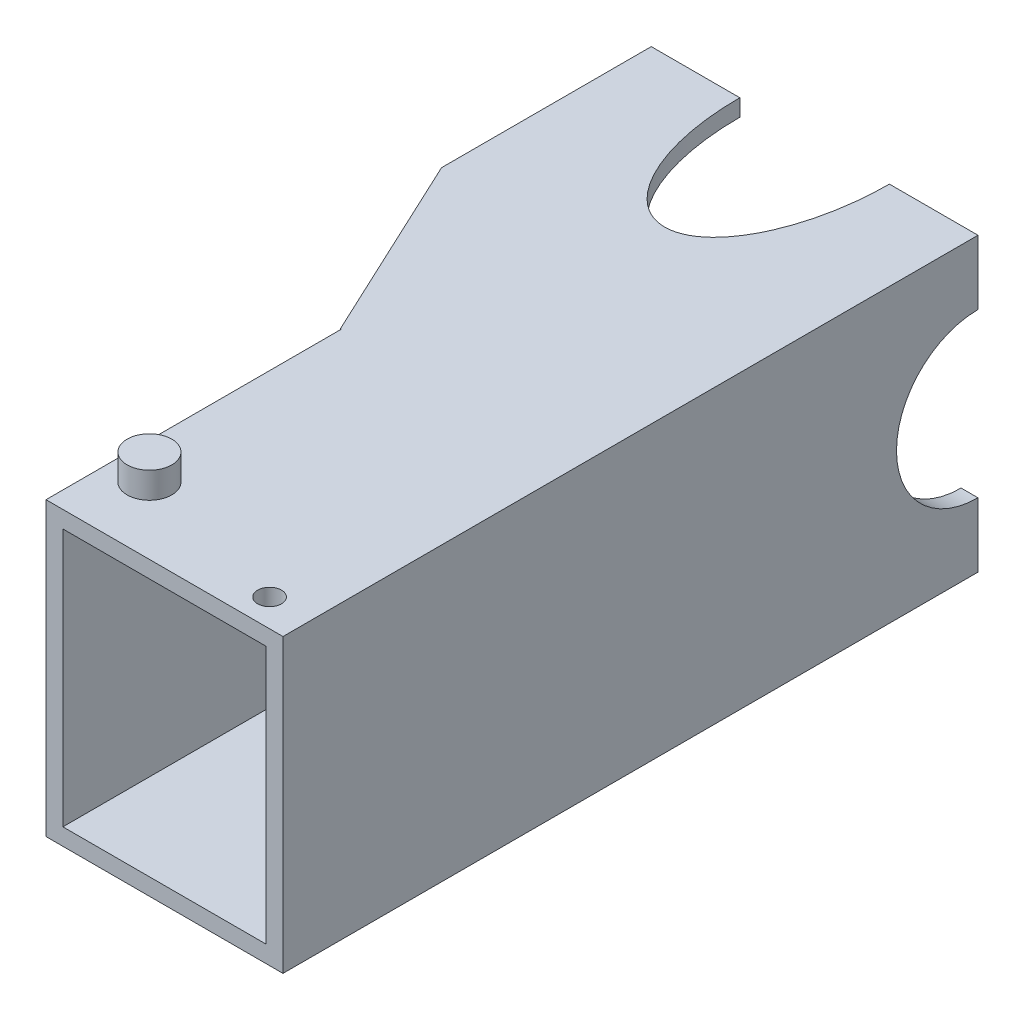
ISO-10303-21;
HEADER;
FILE_DESCRIPTION(('STEP AP214'),'2;1');
FILE_NAME('part.step','',(''),(''),'','','');
FILE_SCHEMA(('AUTOMOTIVE_DESIGN { 1 0 10303 214 1 1 1 1 }'));
ENDSEC;
DATA;
#1=APPLICATION_CONTEXT('core data for automotive mechanical design processes');
#2=APPLICATION_PROTOCOL_DEFINITION('international standard','automotive_design',2000,#1);
#3=PRODUCT_CONTEXT('',#1,'mechanical');
#4=PRODUCT('Part','Part','',(#3));
#5=PRODUCT_RELATED_PRODUCT_CATEGORY('part','',(#4));
#6=PRODUCT_DEFINITION_FORMATION('','',#4);
#7=PRODUCT_DEFINITION_CONTEXT('part definition',#1,'design');
#8=PRODUCT_DEFINITION('design','',#6,#7);
#9=PRODUCT_DEFINITION_SHAPE('','',#8);
#10=(LENGTH_UNIT() NAMED_UNIT(*) SI_UNIT(.MILLI.,.METRE.));
#11=(NAMED_UNIT(*) PLANE_ANGLE_UNIT() SI_UNIT($,.RADIAN.));
#12=(NAMED_UNIT(*) SI_UNIT($,.STERADIAN.) SOLID_ANGLE_UNIT());
#13=UNCERTAINTY_MEASURE_WITH_UNIT(LENGTH_MEASURE(1.E-05),#10,'distance_accuracy_value','');
#14=(GEOMETRIC_REPRESENTATION_CONTEXT(3) GLOBAL_UNCERTAINTY_ASSIGNED_CONTEXT((#13)) GLOBAL_UNIT_ASSIGNED_CONTEXT((#10,
#11,#12)) REPRESENTATION_CONTEXT('',''));
#15=CARTESIAN_POINT('',(0.,0.,0.));
#16=DIRECTION('',(0.,0.,1.));
#17=DIRECTION('',(1.,0.,0.));
#18=AXIS2_PLACEMENT_3D('',#15,#16,#17);
#19=CARTESIAN_POINT('',(0.,0.,0.));
#20=DIRECTION('',(0.,0.,-1.));
#21=DIRECTION('',(-1.,0.,0.));
#22=AXIS2_PLACEMENT_3D('',#19,#20,#21);
#23=PLANE('',#22);
#24=DIRECTION('',(1.,0.,0.));
#25=VECTOR('',#24,1.);
#26=CARTESIAN_POINT('',(-100.,-8.65000000000002,0.));
#27=LINE('',#26,#25);
#28=CARTESIAN_POINT('',(-43.9,-8.65000000000001,0.));
#29=VERTEX_POINT('',#28);
#30=CARTESIAN_POINT('',(-41.63,-8.65000000000001,0.));
#31=VERTEX_POINT('',#30);
#32=EDGE_CURVE('E49',#29,#31,#27,.T.);
#33=ORIENTED_EDGE('',*,*,#32,.F.);
#34=DIRECTION('',(0.,-1.,0.));
#35=VECTOR('',#34,1.);
#36=CARTESIAN_POINT('',(-43.9,0.,0.));
#37=LINE('',#36,#35);
#38=CARTESIAN_POINT('',(-43.9,0.,0.));
#39=VERTEX_POINT('',#38);
#40=EDGE_CURVE('E223',#39,#29,#37,.T.);
#41=ORIENTED_EDGE('',*,*,#40,.F.);
#42=DIRECTION('',(-1.,0.,0.));
#43=VECTOR('',#42,1.);
#44=CARTESIAN_POINT('',(0.,0.,0.));
#45=LINE('',#44,#43);
#46=CARTESIAN_POINT('',(-32.0000394122705,0.,0.));
#47=VERTEX_POINT('',#46);
#48=EDGE_CURVE('E213',#47,#39,#45,.T.);
#49=ORIENTED_EDGE('',*,*,#48,.F.);
#50=DIRECTION('',(0.,1.,0.));
#51=VECTOR('',#50,1.);
#52=CARTESIAN_POINT('',(-32.0000394122705,-100.,0.));
#53=LINE('',#52,#51);
#54=CARTESIAN_POINT('',(-32.0000394122705,-2.27,0.));
#55=VERTEX_POINT('',#54);
#56=EDGE_CURVE('E686',#55,#47,#53,.T.);
#57=ORIENTED_EDGE('',*,*,#56,.F.);
#58=DIRECTION('',(1.,0.,0.));
#59=VECTOR('',#58,1.);
#60=CARTESIAN_POINT('',(-41.63,-2.27,0.));
#61=LINE('',#60,#59);
#62=CARTESIAN_POINT('',(-41.63,-2.27,0.));
#63=VERTEX_POINT('',#62);
#64=EDGE_CURVE('E276',#63,#55,#61,.T.);
#65=ORIENTED_EDGE('',*,*,#64,.F.);
#66=DIRECTION('',(0.,1.,0.));
#67=VECTOR('',#66,1.);
#68=CARTESIAN_POINT('',(-41.63,-36.93,0.));
#69=LINE('',#68,#67);
#70=EDGE_CURVE('E285',#31,#63,#69,.T.);
#71=ORIENTED_EDGE('',*,*,#70,.F.);
#72=EDGE_LOOP('',(#33,#41,#49,#57,#65,#71));
#73=FACE_BOUND('',#72,.T.);
#74=ADVANCED_FACE('F34',(#73),#23,.T.);
#75=DIRECTION('',(1.,0.,0.));
#76=VECTOR('',#75,1.);
#77=CARTESIAN_POINT('',(-100.,-8.65000000000002,0.));
#78=LINE('',#77,#76);
#79=CARTESIAN_POINT('',(-2.26999999999999,-8.65000000000001,0.));
#80=VERTEX_POINT('',#79);
#81=CARTESIAN_POINT('',(0.,-8.65,0.));
#82=VERTEX_POINT('',#81);
#83=EDGE_CURVE('E186',#80,#82,#78,.T.);
#84=ORIENTED_EDGE('',*,*,#83,.F.);
#85=DIRECTION('',(0.,-1.,0.));
#86=VECTOR('',#85,1.);
#87=CARTESIAN_POINT('',(-2.27,-36.93,0.));
#88=LINE('',#87,#86);
#89=CARTESIAN_POINT('',(-2.26999999999999,-2.27,0.));
#90=VERTEX_POINT('',#89);
#91=EDGE_CURVE('E280',#90,#80,#88,.T.);
#92=ORIENTED_EDGE('',*,*,#91,.F.);
#93=CARTESIAN_POINT('',(-11.8999605877295,-2.27,0.));
#94=VERTEX_POINT('',#93);
#95=EDGE_CURVE('E272',#94,#90,#61,.T.);
#96=ORIENTED_EDGE('',*,*,#95,.F.);
#97=DIRECTION('',(0.,1.,0.));
#98=VECTOR('',#97,1.);
#99=CARTESIAN_POINT('',(-11.8999605877295,-100.,0.));
#100=LINE('',#99,#98);
#101=CARTESIAN_POINT('',(-11.8999605877295,0.,0.));
#102=VERTEX_POINT('',#101);
#103=EDGE_CURVE('E279',#102,#94,#100,.F.);
#104=ORIENTED_EDGE('',*,*,#103,.F.);
#105=CARTESIAN_POINT('',(0.,0.,0.));
#106=VERTEX_POINT('',#105);
#107=EDGE_CURVE('E209',#106,#102,#45,.T.);
#108=ORIENTED_EDGE('',*,*,#107,.F.);
#109=DIRECTION('',(0.,1.,0.));
#110=VECTOR('',#109,1.);
#111=CARTESIAN_POINT('',(0.,0.,0.));
#112=LINE('',#111,#110);
#113=EDGE_CURVE('E200',#82,#106,#112,.T.);
#114=ORIENTED_EDGE('',*,*,#113,.F.);
#115=EDGE_LOOP('',(#84,#92,#96,#104,#108,#114));
#116=FACE_BOUND('',#115,.T.);
#117=ADVANCED_FACE('F206',(#116),#23,.T.);
#118=DIRECTION('',(1.,0.,0.));
#119=VECTOR('',#118,1.);
#120=CARTESIAN_POINT('',(-100.,-30.55,0.));
#121=LINE('',#120,#119);
#122=CARTESIAN_POINT('',(-41.63,-30.55,0.));
#123=VERTEX_POINT('',#122);
#124=CARTESIAN_POINT('',(-43.9,-30.55,0.));
#125=VERTEX_POINT('',#124);
#126=EDGE_CURVE('E354',#123,#125,#121,.F.);
#127=ORIENTED_EDGE('',*,*,#126,.F.);
#128=CARTESIAN_POINT('',(-41.63,-36.93,0.));
#129=VERTEX_POINT('',#128);
#130=EDGE_CURVE('E281',#129,#123,#69,.T.);
#131=ORIENTED_EDGE('',*,*,#130,.F.);
#132=DIRECTION('',(-1.,0.,0.));
#133=VECTOR('',#132,1.);
#134=CARTESIAN_POINT('',(-41.63,-36.93,0.));
#135=LINE('',#134,#133);
#136=CARTESIAN_POINT('',(-32.0000394122705,-36.93,0.));
#137=VERTEX_POINT('',#136);
#138=EDGE_CURVE('E290',#137,#129,#135,.T.);
#139=ORIENTED_EDGE('',*,*,#138,.F.);
#140=CARTESIAN_POINT('',(-32.0000394122705,-39.2,0.));
#141=VERTEX_POINT('',#140);
#142=EDGE_CURVE('E681',#141,#137,#53,.T.);
#143=ORIENTED_EDGE('',*,*,#142,.F.);
#144=DIRECTION('',(1.,0.,0.));
#145=VECTOR('',#144,1.);
#146=CARTESIAN_POINT('',(0.,-39.2,0.));
#147=LINE('',#146,#145);
#148=CARTESIAN_POINT('',(-43.9,-39.2,0.));
#149=VERTEX_POINT('',#148);
#150=EDGE_CURVE('E227',#149,#141,#147,.T.);
#151=ORIENTED_EDGE('',*,*,#150,.F.);
#152=EDGE_CURVE('E222',#125,#149,#37,.T.);
#153=ORIENTED_EDGE('',*,*,#152,.F.);
#154=EDGE_LOOP('',(#127,#131,#139,#143,#151,#153));
#155=FACE_BOUND('',#154,.T.);
#156=ADVANCED_FACE('F430',(#155),#23,.T.);
#157=CARTESIAN_POINT('',(0.,0.,93.38));
#158=DIRECTION('',(-1.,0.,0.));
#159=DIRECTION('',(0.,-1.,0.));
#160=AXIS2_PLACEMENT_3D('',#157,#158,#159);
#161=PLANE('',#160);
#162=CARTESIAN_POINT('',(0.,-39.2,0.));
#163=VERTEX_POINT('',#162);
#164=CARTESIAN_POINT('',(0.,-30.55,0.));
#165=VERTEX_POINT('',#164);
#166=EDGE_CURVE('E204',#163,#165,#112,.T.);
#167=ORIENTED_EDGE('',*,*,#166,.T.);
#168=CARTESIAN_POINT('',(0.,-19.6,0.));
#169=DIRECTION('',(1.,0.,0.));
#170=DIRECTION('',(0.,1.,0.));
#171=AXIS2_PLACEMENT_3D('',#168,#169,#170);
#172=CIRCLE('',#171,10.95);
#173=EDGE_CURVE('E189',#82,#165,#172,.T.);
#174=ORIENTED_EDGE('',*,*,#173,.F.);
#175=ORIENTED_EDGE('',*,*,#113,.T.);
#176=DIRECTION('',(0.,0.,-1.));
#177=VECTOR('',#176,1.);
#178=CARTESIAN_POINT('',(0.,0.,93.38));
#179=LINE('',#178,#177);
#180=CARTESIAN_POINT('',(0.,0.,93.38));
#181=VERTEX_POINT('',#180);
#182=EDGE_CURVE('E239',#181,#106,#179,.T.);
#183=ORIENTED_EDGE('',*,*,#182,.F.);
#184=DIRECTION('',(0.,1.,0.));
#185=VECTOR('',#184,1.);
#186=CARTESIAN_POINT('',(0.,0.,93.38));
#187=LINE('',#186,#185);
#188=CARTESIAN_POINT('',(0.,-39.2,93.38));
#189=VERTEX_POINT('',#188);
#190=EDGE_CURVE('E230',#189,#181,#187,.T.);
#191=ORIENTED_EDGE('',*,*,#190,.F.);
#192=DIRECTION('',(0.,0.,-1.));
#193=VECTOR('',#192,1.);
#194=CARTESIAN_POINT('',(0.,-39.2,93.38));
#195=LINE('',#194,#193);
#196=EDGE_CURVE('E231',#189,#163,#195,.T.);
#197=ORIENTED_EDGE('',*,*,#196,.T.);
#198=EDGE_LOOP('',(#167,#174,#175,#183,#191,#197));
#199=FACE_BOUND('',#198,.T.);
#200=ADVANCED_FACE('F198',(#199),#161,.F.);
#201=CARTESIAN_POINT('',(0.,0.,93.38));
#202=DIRECTION('',(0.,-1.,0.));
#203=DIRECTION('',(1.,0.,0.));
#204=AXIS2_PLACEMENT_3D('',#201,#202,#203);
#205=PLANE('',#204);
#206=CARTESIAN_POINT('',(-5.5,0.,89.68));
#207=DIRECTION('',(0.,1.,0.));
#208=DIRECTION('',(-1.,0.,0.));
#209=AXIS2_PLACEMENT_3D('',#206,#207,#208);
#210=CIRCLE('',#209,1.6);
#211=CARTESIAN_POINT('',(-7.1,0.,89.68));
#212=VERTEX_POINT('',#211);
#213=EDGE_CURVE('E266',#212,#212,#210,.T.);
#214=ORIENTED_EDGE('',*,*,#213,.F.);
#215=EDGE_LOOP('',(#214));
#216=FACE_BOUND('',#215,.T.);
#217=CARTESIAN_POINT('',(-26.94,0.,84.38));
#218=DIRECTION('',(0.,-1.,0.));
#219=DIRECTION('',(1.,0.,0.));
#220=AXIS2_PLACEMENT_3D('',#217,#218,#219);
#221=CIRCLE('',#220,3.);
#222=CARTESIAN_POINT('',(-23.94,0.,84.38));
#223=VERTEX_POINT('',#222);
#224=EDGE_CURVE('E260',#223,#223,#221,.F.);
#225=ORIENTED_EDGE('',*,*,#224,.F.);
#226=EDGE_LOOP('',(#225));
#227=FACE_BOUND('',#226,.T.);
#228=ORIENTED_EDGE('',*,*,#107,.T.);
#229=CARTESIAN_POINT('',(-21.95,0.,0.));
#230=DIRECTION('',(0.,1.,0.));
#231=DIRECTION('',(0.00323381393674884,0.,-0.999994771210041));
#232=AXIS2_PLACEMENT_3D('',#229,#230,#231);
#233=ELLIPSE('',#232,20.1001050992277,10.05);
#234=EDGE_CURVE('E356',#47,#102,#233,.T.);
#235=ORIENTED_EDGE('',*,*,#234,.F.);
#236=ORIENTED_EDGE('',*,*,#48,.T.);
#237=DIRECTION('',(0.,0.,-1.));
#238=VECTOR('',#237,1.);
#239=CARTESIAN_POINT('',(-43.9,0.,93.38));
#240=LINE('',#239,#238);
#241=CARTESIAN_POINT('',(-43.9,0.,28.1778938640133));
#242=VERTEX_POINT('',#241);
#243=EDGE_CURVE('E236',#242,#39,#240,.T.);
#244=ORIENTED_EDGE('',*,*,#243,.F.);
#245=DIRECTION('',(-0.423731605419439,0.,-0.905787793342715));
#246=VECTOR('',#245,1.);
#247=CARTESIAN_POINT('',(-44.03,0.,27.9));
#248=LINE('',#247,#246);
#249=CARTESIAN_POINT('',(-31.97,0.,53.68));
#250=VERTEX_POINT('',#249);
#251=EDGE_CURVE('E298',#250,#242,#248,.T.);
#252=ORIENTED_EDGE('',*,*,#251,.F.);
#253=DIRECTION('',(-1.,0.,0.));
#254=VECTOR('',#253,1.);
#255=CARTESIAN_POINT('',(-43.9,0.,53.68));
#256=LINE('',#255,#254);
#257=CARTESIAN_POINT('',(-31.84,0.,53.68));
#258=VERTEX_POINT('',#257);
#259=EDGE_CURVE('E315',#258,#250,#256,.T.);
#260=ORIENTED_EDGE('',*,*,#259,.F.);
#261=DIRECTION('',(0.,0.,-1.));
#262=VECTOR('',#261,1.);
#263=CARTESIAN_POINT('',(-31.84,0.,93.38));
#264=LINE('',#263,#262);
#265=CARTESIAN_POINT('',(-31.84,0.,93.38));
#266=VERTEX_POINT('',#265);
#267=EDGE_CURVE('E312',#266,#258,#264,.T.);
#268=ORIENTED_EDGE('',*,*,#267,.F.);
#269=DIRECTION('',(-1.,0.,0.));
#270=VECTOR('',#269,1.);
#271=CARTESIAN_POINT('',(0.,0.,93.38));
#272=LINE('',#271,#270);
#273=EDGE_CURVE('E320',#181,#266,#272,.T.);
#274=ORIENTED_EDGE('',*,*,#273,.F.);
#275=ORIENTED_EDGE('',*,*,#182,.T.);
#276=EDGE_LOOP('',(#228,#235,#236,#244,#252,#260,#268,#274,#275));
#277=FACE_BOUND('',#276,.T.);
#278=ADVANCED_FACE('F332',(#216,#227,#277),#205,.F.);
#279=CARTESIAN_POINT('',(-43.9,0.,93.38));
#280=DIRECTION('',(1.,0.,0.));
#281=DIRECTION('',(0.,1.,0.));
#282=AXIS2_PLACEMENT_3D('',#279,#280,#281);
#283=PLANE('',#282);
#284=ORIENTED_EDGE('',*,*,#40,.T.);
#285=CARTESIAN_POINT('',(-43.9,-19.6,0.));
#286=DIRECTION('',(1.,0.,0.));
#287=DIRECTION('',(0.,1.,0.));
#288=AXIS2_PLACEMENT_3D('',#285,#286,#287);
#289=CIRCLE('',#288,10.95);
#290=EDGE_CURVE('E353',#29,#125,#289,.T.);
#291=ORIENTED_EDGE('',*,*,#290,.T.);
#292=ORIENTED_EDGE('',*,*,#152,.T.);
#293=DIRECTION('',(0.,0.,-1.));
#294=VECTOR('',#293,1.);
#295=CARTESIAN_POINT('',(-43.9,-39.2,93.38));
#296=LINE('',#295,#294);
#297=CARTESIAN_POINT('',(-43.9,-39.2,28.1778938640132));
#298=VERTEX_POINT('',#297);
#299=EDGE_CURVE('E233',#298,#149,#296,.T.);
#300=ORIENTED_EDGE('',*,*,#299,.F.);
#301=DIRECTION('',(0.,1.,0.));
#302=VECTOR('',#301,1.);
#303=CARTESIAN_POINT('',(-43.9,0.,28.1778938640132));
#304=LINE('',#303,#302);
#305=EDGE_CURVE('E309',#298,#242,#304,.T.);
#306=ORIENTED_EDGE('',*,*,#305,.T.);
#307=ORIENTED_EDGE('',*,*,#243,.T.);
#308=EDGE_LOOP('',(#284,#291,#292,#300,#306,#307));
#309=FACE_BOUND('',#308,.T.);
#310=ADVANCED_FACE('F349',(#309),#283,.F.);
#311=CARTESIAN_POINT('',(0.,-39.2,93.38));
#312=DIRECTION('',(0.,1.,0.));
#313=DIRECTION('',(-1.,0.,0.));
#314=AXIS2_PLACEMENT_3D('',#311,#312,#313);
#315=PLANE('',#314);
#316=CARTESIAN_POINT('',(-26.94,-39.2,84.38));
#317=DIRECTION('',(0.,1.,0.));
#318=DIRECTION('',(-1.,0.,0.));
#319=AXIS2_PLACEMENT_3D('',#316,#317,#318);
#320=CIRCLE('',#319,3.);
#321=CARTESIAN_POINT('',(-29.94,-39.2,84.38));
#322=VERTEX_POINT('',#321);
#323=EDGE_CURVE('E257',#322,#322,#320,.F.);
#324=ORIENTED_EDGE('',*,*,#323,.F.);
#325=EDGE_LOOP('',(#324));
#326=FACE_BOUND('',#325,.T.);
#327=ORIENTED_EDGE('',*,*,#150,.T.);
#328=CARTESIAN_POINT('',(-21.95,-39.2,0.));
#329=DIRECTION('',(0.,1.,0.));
#330=DIRECTION('',(0.00323381393674884,0.,-0.999994771210041));
#331=AXIS2_PLACEMENT_3D('',#328,#329,#330);
#332=ELLIPSE('',#331,20.1001050992277,10.05);
#333=CARTESIAN_POINT('',(-11.8999605877295,-39.2,0.));
#334=VERTEX_POINT('',#333);
#335=EDGE_CURVE('E679',#141,#334,#332,.T.);
#336=ORIENTED_EDGE('',*,*,#335,.T.);
#337=EDGE_CURVE('E226',#334,#163,#147,.T.);
#338=ORIENTED_EDGE('',*,*,#337,.T.);
#339=ORIENTED_EDGE('',*,*,#196,.F.);
#340=DIRECTION('',(1.,0.,0.));
#341=VECTOR('',#340,1.);
#342=CARTESIAN_POINT('',(0.,-39.2,93.38));
#343=LINE('',#342,#341);
#344=CARTESIAN_POINT('',(-31.84,-39.2,93.38));
#345=VERTEX_POINT('',#344);
#346=EDGE_CURVE('E219',#345,#189,#343,.T.);
#347=ORIENTED_EDGE('',*,*,#346,.F.);
#348=DIRECTION('',(0.,0.,-1.));
#349=VECTOR('',#348,1.);
#350=CARTESIAN_POINT('',(-31.84,-39.2,93.38));
#351=LINE('',#350,#349);
#352=CARTESIAN_POINT('',(-31.84,-39.2,53.68));
#353=VERTEX_POINT('',#352);
#354=EDGE_CURVE('E211',#345,#353,#351,.T.);
#355=ORIENTED_EDGE('',*,*,#354,.T.);
#356=DIRECTION('',(-1.,0.,0.));
#357=VECTOR('',#356,1.);
#358=CARTESIAN_POINT('',(0.,-39.2,53.68));
#359=LINE('',#358,#357);
#360=CARTESIAN_POINT('',(-31.97,-39.2,53.68));
#361=VERTEX_POINT('',#360);
#362=EDGE_CURVE('E244',#353,#361,#359,.T.);
#363=ORIENTED_EDGE('',*,*,#362,.T.);
#364=DIRECTION('',(-0.423731605419439,0.,-0.905787793342715));
#365=VECTOR('',#364,1.);
#366=CARTESIAN_POINT('',(-10.9925419454553,-39.2,98.5223605842588));
#367=LINE('',#366,#365);
#368=EDGE_CURVE('E306',#361,#298,#367,.T.);
#369=ORIENTED_EDGE('',*,*,#368,.T.);
#370=ORIENTED_EDGE('',*,*,#299,.T.);
#371=EDGE_LOOP('',(#327,#336,#338,#339,#347,#355,#363,#369,#370));
#372=FACE_BOUND('',#371,.T.);
#373=ADVANCED_FACE('F328',(#326,#372),#315,.F.);
#374=CARTESIAN_POINT('',(0.,0.,93.38));
#375=DIRECTION('',(0.,0.,-1.));
#376=DIRECTION('',(-1.,0.,0.));
#377=AXIS2_PLACEMENT_3D('',#374,#375,#376);
#378=PLANE('',#377);
#379=DIRECTION('',(1.,0.,0.));
#380=VECTOR('',#379,1.);
#381=CARTESIAN_POINT('',(-29.57,-36.93,93.38));
#382=LINE('',#381,#380);
#383=CARTESIAN_POINT('',(-29.57,-36.93,93.38));
#384=VERTEX_POINT('',#383);
#385=CARTESIAN_POINT('',(-2.27,-36.93,93.38));
#386=VERTEX_POINT('',#385);
#387=EDGE_CURVE('E654',#384,#386,#382,.T.);
#388=ORIENTED_EDGE('',*,*,#387,.F.);
#389=DIRECTION('',(0.,-1.,0.));
#390=VECTOR('',#389,1.);
#391=CARTESIAN_POINT('',(-29.57,-36.93,93.38));
#392=LINE('',#391,#390);
#393=CARTESIAN_POINT('',(-29.57,-2.27,93.38));
#394=VERTEX_POINT('',#393);
#395=EDGE_CURVE('E643',#394,#384,#392,.T.);
#396=ORIENTED_EDGE('',*,*,#395,.F.);
#397=DIRECTION('',(-1.,0.,0.));
#398=VECTOR('',#397,1.);
#399=CARTESIAN_POINT('',(-29.57,-2.27,93.38));
#400=LINE('',#399,#398);
#401=CARTESIAN_POINT('',(-2.26999999999999,-2.27,93.38));
#402=VERTEX_POINT('',#401);
#403=EDGE_CURVE('E646',#402,#394,#400,.T.);
#404=ORIENTED_EDGE('',*,*,#403,.F.);
#405=DIRECTION('',(0.,1.,0.));
#406=VECTOR('',#405,1.);
#407=CARTESIAN_POINT('',(-2.27,-36.93,93.38));
#408=LINE('',#407,#406);
#409=EDGE_CURVE('E649',#386,#402,#408,.T.);
#410=ORIENTED_EDGE('',*,*,#409,.F.);
#411=EDGE_LOOP('',(#388,#396,#404,#410));
#412=FACE_BOUND('',#411,.T.);
#413=ORIENTED_EDGE('',*,*,#273,.T.);
#414=DIRECTION('',(0.,-1.,0.));
#415=VECTOR('',#414,1.);
#416=CARTESIAN_POINT('',(-31.84,0.,93.38));
#417=LINE('',#416,#415);
#418=EDGE_CURVE('E241',#266,#345,#417,.T.);
#419=ORIENTED_EDGE('',*,*,#418,.T.);
#420=ORIENTED_EDGE('',*,*,#346,.T.);
#421=ORIENTED_EDGE('',*,*,#190,.T.);
#422=EDGE_LOOP('',(#413,#419,#420,#421));
#423=FACE_BOUND('',#422,.T.);
#424=ADVANCED_FACE('F325',(#412,#423),#378,.F.);
#425=DIRECTION('',(1.,0.,0.));
#426=VECTOR('',#425,1.);
#427=CARTESIAN_POINT('',(-100.,-30.55,0.));
#428=LINE('',#427,#426);
#429=CARTESIAN_POINT('',(-2.26999999999999,-30.55,0.));
#430=VERTEX_POINT('',#429);
#431=EDGE_CURVE('E57',#165,#430,#428,.F.);
#432=ORIENTED_EDGE('',*,*,#431,.F.);
#433=ORIENTED_EDGE('',*,*,#166,.F.);
#434=ORIENTED_EDGE('',*,*,#337,.F.);
#435=CARTESIAN_POINT('',(-11.8999605877295,-36.93,0.));
#436=VERTEX_POINT('',#435);
#437=EDGE_CURVE('E685',#436,#334,#100,.F.);
#438=ORIENTED_EDGE('',*,*,#437,.F.);
#439=CARTESIAN_POINT('',(-2.27,-36.93,0.));
#440=VERTEX_POINT('',#439);
#441=EDGE_CURVE('E291',#440,#436,#135,.T.);
#442=ORIENTED_EDGE('',*,*,#441,.F.);
#443=EDGE_CURVE('E283',#430,#440,#88,.T.);
#444=ORIENTED_EDGE('',*,*,#443,.F.);
#445=EDGE_LOOP('',(#432,#433,#434,#438,#442,#444));
#446=FACE_BOUND('',#445,.T.);
#447=ADVANCED_FACE('F421',(#446),#23,.T.);
#448=CARTESIAN_POINT('',(-43.9,-93.38,53.68));
#449=DIRECTION('',(0.,0.,-1.));
#450=DIRECTION('',(-1.,0.,0.));
#451=AXIS2_PLACEMENT_3D('',#448,#449,#450);
#452=PLANE('',#451);
#453=ORIENTED_EDGE('',*,*,#259,.T.);
#454=DIRECTION('',(0.,-1.,0.));
#455=VECTOR('',#454,1.);
#456=CARTESIAN_POINT('',(-31.97,-93.38,53.68));
#457=LINE('',#456,#455);
#458=EDGE_CURVE('E247',#250,#361,#457,.T.);
#459=ORIENTED_EDGE('',*,*,#458,.T.);
#460=ORIENTED_EDGE('',*,*,#362,.F.);
#461=DIRECTION('',(0.,1.,0.));
#462=VECTOR('',#461,1.);
#463=CARTESIAN_POINT('',(-31.84,-93.38,53.68));
#464=LINE('',#463,#462);
#465=EDGE_CURVE('E215',#353,#258,#464,.T.);
#466=ORIENTED_EDGE('',*,*,#465,.T.);
#467=EDGE_LOOP('',(#453,#459,#460,#466));
#468=FACE_BOUND('',#467,.T.);
#469=ADVANCED_FACE('F342',(#468),#452,.F.);
#470=CARTESIAN_POINT('',(-31.84,-93.38,93.38));
#471=DIRECTION('',(1.,0.,0.));
#472=DIRECTION('',(0.,1.,0.));
#473=AXIS2_PLACEMENT_3D('',#470,#471,#472);
#474=PLANE('',#473);
#475=ORIENTED_EDGE('',*,*,#418,.F.);
#476=ORIENTED_EDGE('',*,*,#267,.T.);
#477=ORIENTED_EDGE('',*,*,#465,.F.);
#478=ORIENTED_EDGE('',*,*,#354,.F.);
#479=EDGE_LOOP('',(#475,#476,#477,#478));
#480=FACE_BOUND('',#479,.T.);
#481=ADVANCED_FACE('F339',(#480),#474,.F.);
#482=CARTESIAN_POINT('',(-44.03,-93.38,27.9));
#483=DIRECTION('',(0.905787793342715,0.,-0.423731605419439));
#484=DIRECTION('',(-0.423731605419439,0.,-0.905787793342715));
#485=AXIS2_PLACEMENT_3D('',#482,#483,#484);
#486=PLANE('',#485);
#487=ORIENTED_EDGE('',*,*,#368,.F.);
#488=ORIENTED_EDGE('',*,*,#458,.F.);
#489=ORIENTED_EDGE('',*,*,#251,.T.);
#490=ORIENTED_EDGE('',*,*,#305,.F.);
#491=EDGE_LOOP('',(#487,#488,#489,#490));
#492=FACE_BOUND('',#491,.T.);
#493=ADVANCED_FACE('F344',(#492),#486,.F.);
#494=CARTESIAN_POINT('',(-41.63,-36.93,27.4));
#495=DIRECTION('',(-1.,0.,0.));
#496=DIRECTION('',(0.,0.,1.));
#497=AXIS2_PLACEMENT_3D('',#494,#495,#496);
#498=PLANE('',#497);
#499=ORIENTED_EDGE('',*,*,#130,.T.);
#500=CARTESIAN_POINT('',(-41.63,-19.6,0.));
#501=DIRECTION('',(-1.,0.,0.));
#502=DIRECTION('',(0.,0.,1.));
#503=AXIS2_PLACEMENT_3D('',#500,#501,#502);
#504=CIRCLE('',#503,10.95);
#505=EDGE_CURVE('E194',#123,#31,#504,.T.);
#506=ORIENTED_EDGE('',*,*,#505,.T.);
#507=ORIENTED_EDGE('',*,*,#70,.T.);
#508=DIRECTION('',(0.,0.,-1.));
#509=VECTOR('',#508,1.);
#510=CARTESIAN_POINT('',(-41.63,-2.27,27.4));
#511=LINE('',#510,#509);
#512=CARTESIAN_POINT('',(-41.63,-2.27,27.1159776498938));
#513=VERTEX_POINT('',#512);
#514=EDGE_CURVE('E294',#513,#63,#511,.T.);
#515=ORIENTED_EDGE('',*,*,#514,.F.);
#516=DIRECTION('',(0.,-1.,0.));
#517=VECTOR('',#516,1.);
#518=CARTESIAN_POINT('',(-41.63,-36.93,27.1159776498938));
#519=LINE('',#518,#517);
#520=CARTESIAN_POINT('',(-41.63,-36.93,27.1159776498938));
#521=VERTEX_POINT('',#520);
#522=EDGE_CURVE('E657',#513,#521,#519,.T.);
#523=ORIENTED_EDGE('',*,*,#522,.T.);
#524=DIRECTION('',(0.,0.,-1.));
#525=VECTOR('',#524,1.);
#526=CARTESIAN_POINT('',(-41.63,-36.93,27.4));
#527=LINE('',#526,#525);
#528=EDGE_CURVE('E295',#521,#129,#527,.T.);
#529=ORIENTED_EDGE('',*,*,#528,.T.);
#530=EDGE_LOOP('',(#499,#506,#507,#515,#523,#529));
#531=FACE_BOUND('',#530,.T.);
#532=ADVANCED_FACE('F406',(#531),#498,.F.);
#533=CARTESIAN_POINT('',(-41.63,-36.93,27.4));
#534=DIRECTION('',(0.,-1.,0.));
#535=DIRECTION('',(1.,0.,0.));
#536=AXIS2_PLACEMENT_3D('',#533,#534,#535);
#537=PLANE('',#536);
#538=ORIENTED_EDGE('',*,*,#441,.T.);
#539=CARTESIAN_POINT('',(-21.95,-36.93,0.));
#540=DIRECTION('',(0.,1.,0.));
#541=DIRECTION('',(0.00323381393674884,0.,-0.999994771210041));
#542=AXIS2_PLACEMENT_3D('',#539,#540,#541);
#543=ELLIPSE('',#542,20.1001050992277,10.05);
#544=EDGE_CURVE('E682',#436,#137,#543,.F.);
#545=ORIENTED_EDGE('',*,*,#544,.T.);
#546=ORIENTED_EDGE('',*,*,#138,.T.);
#547=ORIENTED_EDGE('',*,*,#528,.F.);
#548=DIRECTION('',(-0.905787793342715,0.,0.423731605419439));
#549=VECTOR('',#548,1.);
#550=CARTESIAN_POINT('',(-23.7281058422577,-36.93,18.7413910113223));
#551=LINE('',#550,#549);
#552=CARTESIAN_POINT('',(-41.843861709112,-36.93,27.2160231197111));
#553=VERTEX_POINT('',#552);
#554=EDGE_CURVE('E661',#521,#553,#551,.T.);
#555=ORIENTED_EDGE('',*,*,#554,.T.);
#556=DIRECTION('',(0.423731605419439,0.,0.905787793342715));
#557=VECTOR('',#556,1.);
#558=CARTESIAN_POINT('',(-41.843861709112,-36.93,27.2160231197111));
#559=LINE('',#558,#557);
#560=CARTESIAN_POINT('',(-29.783861709112,-36.93,52.9960231197111));
#561=VERTEX_POINT('',#560);
#562=EDGE_CURVE('E640',#553,#561,#559,.T.);
#563=ORIENTED_EDGE('',*,*,#562,.T.);
#564=CARTESIAN_POINT('',(-39.57,-36.93,55.0530834862575));
#565=DIRECTION('',(0.,-1.,0.));
#566=DIRECTION('',(1.,0.,0.));
#567=AXIS2_PLACEMENT_3D('',#564,#565,#566);
#568=CIRCLE('',#567,10.);
#569=CARTESIAN_POINT('',(-29.57,-36.93,55.0530834862575));
#570=VERTEX_POINT('',#569);
#571=EDGE_CURVE('E255',#561,#570,#568,.T.);
#572=ORIENTED_EDGE('',*,*,#571,.T.);
#573=DIRECTION('',(0.,0.,1.));
#574=VECTOR('',#573,1.);
#575=CARTESIAN_POINT('',(-29.57,-36.93,-6.62000000000002));
#576=LINE('',#575,#574);
#577=EDGE_CURVE('E637',#570,#384,#576,.T.);
#578=ORIENTED_EDGE('',*,*,#577,.T.);
#579=ORIENTED_EDGE('',*,*,#387,.T.);
#580=DIRECTION('',(0.,0.,-1.));
#581=VECTOR('',#580,1.);
#582=CARTESIAN_POINT('',(-2.27,-36.93,27.4));
#583=LINE('',#582,#581);
#584=EDGE_CURVE('E299',#386,#440,#583,.T.);
#585=ORIENTED_EDGE('',*,*,#584,.T.);
#586=EDGE_LOOP('',(#538,#545,#546,#547,#555,#563,#572,#578,#579,#585));
#587=FACE_BOUND('',#586,.T.);
#588=ADVANCED_FACE('F402',(#587),#537,.F.);
#589=CARTESIAN_POINT('',(-2.27,-36.93,27.4));
#590=DIRECTION('',(1.,0.,0.));
#591=DIRECTION('',(0.,1.,0.));
#592=AXIS2_PLACEMENT_3D('',#589,#590,#591);
#593=PLANE('',#592);
#594=ORIENTED_EDGE('',*,*,#91,.T.);
#595=CARTESIAN_POINT('',(-2.26999999999999,-19.6,0.));
#596=DIRECTION('',(1.,0.,0.));
#597=DIRECTION('',(0.,1.,0.));
#598=AXIS2_PLACEMENT_3D('',#595,#596,#597);
#599=CIRCLE('',#598,10.95);
#600=EDGE_CURVE('E12',#80,#430,#599,.T.);
#601=ORIENTED_EDGE('',*,*,#600,.T.);
#602=ORIENTED_EDGE('',*,*,#443,.T.);
#603=ORIENTED_EDGE('',*,*,#584,.F.);
#604=ORIENTED_EDGE('',*,*,#409,.T.);
#605=DIRECTION('',(0.,0.,-1.));
#606=VECTOR('',#605,1.);
#607=CARTESIAN_POINT('',(-2.26999999999999,-2.27,27.4));
#608=LINE('',#607,#606);
#609=EDGE_CURVE('E302',#402,#90,#608,.T.);
#610=ORIENTED_EDGE('',*,*,#609,.T.);
#611=EDGE_LOOP('',(#594,#601,#602,#603,#604,#610));
#612=FACE_BOUND('',#611,.T.);
#613=ADVANCED_FACE('F405',(#612),#593,.F.);
#614=CARTESIAN_POINT('',(-41.63,-2.27,27.4));
#615=DIRECTION('',(0.,1.,0.));
#616=DIRECTION('',(-1.,0.,0.));
#617=AXIS2_PLACEMENT_3D('',#614,#615,#616);
#618=PLANE('',#617);
#619=CARTESIAN_POINT('',(-5.5,-2.27,89.68));
#620=DIRECTION('',(0.,1.,0.));
#621=DIRECTION('',(-1.,0.,0.));
#622=AXIS2_PLACEMENT_3D('',#619,#620,#621);
#623=CIRCLE('',#622,1.6);
#624=CARTESIAN_POINT('',(-7.1,-2.27,89.68));
#625=VERTEX_POINT('',#624);
#626=EDGE_CURVE('E263',#625,#625,#623,.T.);
#627=ORIENTED_EDGE('',*,*,#626,.T.);
#628=EDGE_LOOP('',(#627));
#629=FACE_BOUND('',#628,.T.);
#630=ORIENTED_EDGE('',*,*,#64,.T.);
#631=CARTESIAN_POINT('',(-21.95,-2.26999999999999,0.));
#632=DIRECTION('',(0.,1.,0.));
#633=DIRECTION('',(0.00323381393674884,0.,-0.999994771210041));
#634=AXIS2_PLACEMENT_3D('',#631,#632,#633);
#635=ELLIPSE('',#634,20.1001050992277,10.05);
#636=EDGE_CURVE('E42',#55,#94,#635,.T.);
#637=ORIENTED_EDGE('',*,*,#636,.T.);
#638=ORIENTED_EDGE('',*,*,#95,.T.);
#639=ORIENTED_EDGE('',*,*,#609,.F.);
#640=ORIENTED_EDGE('',*,*,#403,.T.);
#641=DIRECTION('',(0.,0.,1.));
#642=VECTOR('',#641,1.);
#643=CARTESIAN_POINT('',(-29.57,-2.27,-6.62000000000002));
#644=LINE('',#643,#642);
#645=CARTESIAN_POINT('',(-29.57,-2.27,55.0530834862575));
#646=VERTEX_POINT('',#645);
#647=EDGE_CURVE('E645',#646,#394,#644,.T.);
#648=ORIENTED_EDGE('',*,*,#647,.F.);
#649=CARTESIAN_POINT('',(-39.57,-2.27,55.0530834862575));
#650=DIRECTION('',(0.,1.,0.));
#651=DIRECTION('',(-1.,0.,0.));
#652=AXIS2_PLACEMENT_3D('',#649,#650,#651);
#653=CIRCLE('',#652,10.);
#654=CARTESIAN_POINT('',(-29.783861709112,-2.27,52.9960231197111));
#655=VERTEX_POINT('',#654);
#656=EDGE_CURVE('E253',#646,#655,#653,.T.);
#657=ORIENTED_EDGE('',*,*,#656,.T.);
#658=DIRECTION('',(-0.423731605419439,0.,-0.905787793342715));
#659=VECTOR('',#658,1.);
#660=CARTESIAN_POINT('',(-41.843861709112,-2.27,27.2160231197111));
#661=LINE('',#660,#659);
#662=CARTESIAN_POINT('',(-41.843861709112,-2.27,27.2160231197111));
#663=VERTEX_POINT('',#662);
#664=EDGE_CURVE('E663',#655,#663,#661,.T.);
#665=ORIENTED_EDGE('',*,*,#664,.T.);
#666=DIRECTION('',(-0.905787793342715,0.,0.423731605419439));
#667=VECTOR('',#666,1.);
#668=CARTESIAN_POINT('',(-23.7281058422577,-2.27,18.7413910113223));
#669=LINE('',#668,#667);
#670=EDGE_CURVE('E660',#513,#663,#669,.T.);
#671=ORIENTED_EDGE('',*,*,#670,.F.);
#672=ORIENTED_EDGE('',*,*,#514,.T.);
#673=EDGE_LOOP('',(#630,#637,#638,#639,#640,#648,#657,#665,#671,#672));
#674=FACE_BOUND('',#673,.T.);
#675=ADVANCED_FACE('F271',(#629,#674),#618,.F.);
#676=CARTESIAN_POINT('',(-29.57,-36.93,-6.62000000000002));
#677=DIRECTION('',(-1.,0.,0.));
#678=DIRECTION('',(0.,0.,1.));
#679=AXIS2_PLACEMENT_3D('',#676,#677,#678);
#680=PLANE('',#679);
#681=ORIENTED_EDGE('',*,*,#577,.F.);
#682=DIRECTION('',(0.,1.,0.));
#683=VECTOR('',#682,1.);
#684=CARTESIAN_POINT('',(-29.57,-36.93,55.0530834862575));
#685=LINE('',#684,#683);
#686=EDGE_CURVE('E250',#570,#646,#685,.T.);
#687=ORIENTED_EDGE('',*,*,#686,.T.);
#688=ORIENTED_EDGE('',*,*,#647,.T.);
#689=ORIENTED_EDGE('',*,*,#395,.T.);
#690=EDGE_LOOP('',(#681,#687,#688,#689));
#691=FACE_BOUND('',#690,.T.);
#692=ADVANCED_FACE('F397',(#691),#680,.F.);
#693=CARTESIAN_POINT('',(-23.7281058422577,-36.93,18.7413910113223));
#694=DIRECTION('',(-0.423731605419439,0.,-0.905787793342715));
#695=DIRECTION('',(-0.905787793342715,0.,0.423731605419439));
#696=AXIS2_PLACEMENT_3D('',#693,#694,#695);
#697=PLANE('',#696);
#698=ORIENTED_EDGE('',*,*,#670,.T.);
#699=DIRECTION('',(0.,-1.,0.));
#700=VECTOR('',#699,1.);
#701=CARTESIAN_POINT('',(-41.843861709112,-36.93,27.2160231197111));
#702=LINE('',#701,#700);
#703=EDGE_CURVE('E669',#663,#553,#702,.T.);
#704=ORIENTED_EDGE('',*,*,#703,.T.);
#705=ORIENTED_EDGE('',*,*,#554,.F.);
#706=ORIENTED_EDGE('',*,*,#522,.F.);
#707=EDGE_LOOP('',(#698,#704,#705,#706));
#708=FACE_BOUND('',#707,.T.);
#709=ADVANCED_FACE('F393',(#708),#697,.F.);
#710=CARTESIAN_POINT('',(-44.7766669759344,0.,20.9467262889747));
#711=DIRECTION('',(0.905787793342715,0.,-0.423731605419439));
#712=DIRECTION('',(-0.423731605419439,0.,-0.905787793342715));
#713=AXIS2_PLACEMENT_3D('',#710,#711,#712);
#714=PLANE('',#713);
#715=ORIENTED_EDGE('',*,*,#703,.F.);
#716=ORIENTED_EDGE('',*,*,#664,.F.);
#717=DIRECTION('',(0.,1.,0.));
#718=VECTOR('',#717,1.);
#719=CARTESIAN_POINT('',(-29.783861709112,-36.93,52.9960231197111));
#720=LINE('',#719,#718);
#721=EDGE_CURVE('E633',#561,#655,#720,.T.);
#722=ORIENTED_EDGE('',*,*,#721,.F.);
#723=ORIENTED_EDGE('',*,*,#562,.F.);
#724=EDGE_LOOP('',(#715,#716,#722,#723));
#725=FACE_BOUND('',#724,.T.);
#726=ADVANCED_FACE('F390',(#725),#714,.T.);
#727=CARTESIAN_POINT('',(-39.57,-36.93,55.0530834862575));
#728=DIRECTION('',(0.,1.,0.));
#729=DIRECTION('',(-1.,0.,0.));
#730=AXIS2_PLACEMENT_3D('',#727,#728,#729);
#731=CYLINDRICAL_SURFACE('',#730,10.);
#732=ORIENTED_EDGE('',*,*,#571,.F.);
#733=ORIENTED_EDGE('',*,*,#721,.T.);
#734=ORIENTED_EDGE('',*,*,#656,.F.);
#735=ORIENTED_EDGE('',*,*,#686,.F.);
#736=EDGE_LOOP('',(#732,#733,#734,#735));
#737=FACE_BOUND('',#736,.T.);
#738=ADVANCED_FACE('F36',(#737),#731,.T.);
#739=CARTESIAN_POINT('',(-26.94,-42.7,84.38));
#740=DIRECTION('',(0.,1.,0.));
#741=DIRECTION('',(-1.,0.,0.));
#742=AXIS2_PLACEMENT_3D('',#739,#740,#741);
#743=CYLINDRICAL_SURFACE('',#742,3.);
#744=CARTESIAN_POINT('',(-26.94,-42.7,84.38));
#745=DIRECTION('',(0.,-1.,0.));
#746=DIRECTION('',(1.,0.,0.));
#747=AXIS2_PLACEMENT_3D('',#744,#745,#746);
#748=CIRCLE('',#747,3.);
#749=CARTESIAN_POINT('',(-23.94,-42.7,84.38));
#750=VERTEX_POINT('',#749);
#751=EDGE_CURVE('E672',#750,#750,#748,.T.);
#752=ORIENTED_EDGE('',*,*,#751,.F.);
#753=EDGE_LOOP('',(#752));
#754=FACE_BOUND('',#753,.T.);
#755=ORIENTED_EDGE('',*,*,#323,.T.);
#756=EDGE_LOOP('',(#755));
#757=FACE_BOUND('',#756,.T.);
#758=ADVANCED_FACE('F385',(#754,#757),#743,.T.);
#759=CARTESIAN_POINT('',(-26.94,-42.7,84.38));
#760=DIRECTION('',(0.,-1.,0.));
#761=DIRECTION('',(1.,0.,0.));
#762=AXIS2_PLACEMENT_3D('',#759,#760,#761);
#763=PLANE('',#762);
#764=ORIENTED_EDGE('',*,*,#751,.T.);
#765=EDGE_LOOP('',(#764));
#766=FACE_BOUND('',#765,.T.);
#767=ADVANCED_FACE('F381',(#766),#763,.T.);
#768=CARTESIAN_POINT('',(-26.94,3.5,84.38));
#769=DIRECTION('',(0.,-1.,0.));
#770=DIRECTION('',(1.,0.,0.));
#771=AXIS2_PLACEMENT_3D('',#768,#769,#770);
#772=CYLINDRICAL_SURFACE('',#771,3.);
#773=CARTESIAN_POINT('',(-26.94,3.5,84.38));
#774=DIRECTION('',(0.,1.,0.));
#775=DIRECTION('',(-1.,0.,0.));
#776=AXIS2_PLACEMENT_3D('',#773,#774,#775);
#777=CIRCLE('',#776,3.);
#778=CARTESIAN_POINT('',(-29.94,3.5,84.38));
#779=VERTEX_POINT('',#778);
#780=EDGE_CURVE('E265',#779,#779,#777,.T.);
#781=ORIENTED_EDGE('',*,*,#780,.F.);
#782=EDGE_LOOP('',(#781));
#783=FACE_BOUND('',#782,.T.);
#784=ORIENTED_EDGE('',*,*,#224,.T.);
#785=EDGE_LOOP('',(#784));
#786=FACE_BOUND('',#785,.T.);
#787=ADVANCED_FACE('F377',(#783,#786),#772,.T.);
#788=CARTESIAN_POINT('',(-26.94,3.5,84.38));
#789=DIRECTION('',(0.,1.,0.));
#790=DIRECTION('',(-1.,0.,0.));
#791=AXIS2_PLACEMENT_3D('',#788,#789,#790);
#792=PLANE('',#791);
#793=ORIENTED_EDGE('',*,*,#780,.T.);
#794=EDGE_LOOP('',(#793));
#795=FACE_BOUND('',#794,.T.);
#796=ADVANCED_FACE('F373',(#795),#792,.T.);
#797=CARTESIAN_POINT('',(-5.5,-3.5,89.68));
#798=DIRECTION('',(0.,1.,0.));
#799=DIRECTION('',(-1.,0.,0.));
#800=AXIS2_PLACEMENT_3D('',#797,#798,#799);
#801=CYLINDRICAL_SURFACE('',#800,1.6);
#802=ORIENTED_EDGE('',*,*,#213,.T.);
#803=EDGE_LOOP('',(#802));
#804=FACE_BOUND('',#803,.T.);
#805=ORIENTED_EDGE('',*,*,#626,.F.);
#806=EDGE_LOOP('',(#805));
#807=FACE_BOUND('',#806,.T.);
#808=ADVANCED_FACE('F370',(#804,#807),#801,.F.);
#809=CARTESIAN_POINT('',(-21.95,-100.,0.));
#810=DIRECTION('',(0.,1.,0.));
#811=DIRECTION('',(0.00323381393674884,0.,-0.999994771210041));
#812=AXIS2_PLACEMENT_3D('',#809,#810,#811);
#813=ELLIPSE('',#812,20.1001050992277,10.05);
#814=DIRECTION('',(0.,1.,0.));
#815=VECTOR('',#814,1.);
#816=SURFACE_OF_LINEAR_EXTRUSION('',#813,#815);
#817=ORIENTED_EDGE('',*,*,#56,.T.);
#818=ORIENTED_EDGE('',*,*,#234,.T.);
#819=ORIENTED_EDGE('',*,*,#103,.T.);
#820=ORIENTED_EDGE('',*,*,#636,.F.);
#821=EDGE_LOOP('',(#817,#818,#819,#820));
#822=FACE_BOUND('',#821,.T.);
#823=ADVANCED_FACE('F365',(#822),#816,.F.);
#824=ORIENTED_EDGE('',*,*,#142,.T.);
#825=ORIENTED_EDGE('',*,*,#544,.F.);
#826=ORIENTED_EDGE('',*,*,#437,.T.);
#827=ORIENTED_EDGE('',*,*,#335,.F.);
#828=EDGE_LOOP('',(#824,#825,#826,#827));
#829=FACE_BOUND('',#828,.T.);
#830=ADVANCED_FACE('F369',(#829),#816,.F.);
#831=CARTESIAN_POINT('',(-100.,-19.6,0.));
#832=DIRECTION('',(1.,0.,0.));
#833=DIRECTION('',(0.,1.,0.));
#834=AXIS2_PLACEMENT_3D('',#831,#832,#833);
#835=CYLINDRICAL_SURFACE('',#834,10.95);
#836=ORIENTED_EDGE('',*,*,#83,.T.);
#837=ORIENTED_EDGE('',*,*,#173,.T.);
#838=ORIENTED_EDGE('',*,*,#431,.T.);
#839=ORIENTED_EDGE('',*,*,#600,.F.);
#840=EDGE_LOOP('',(#836,#837,#838,#839));
#841=FACE_BOUND('',#840,.T.);
#842=ADVANCED_FACE('F188',(#841),#835,.F.);
#843=ORIENTED_EDGE('',*,*,#32,.T.);
#844=ORIENTED_EDGE('',*,*,#505,.F.);
#845=ORIENTED_EDGE('',*,*,#126,.T.);
#846=ORIENTED_EDGE('',*,*,#290,.F.);
#847=EDGE_LOOP('',(#843,#844,#845,#846));
#848=FACE_BOUND('',#847,.T.);
#849=ADVANCED_FACE('F501',(#848),#835,.F.);
#850=CLOSED_SHELL('',(#74,#117,#156,#200,#278,#310,#373,#424,#447,#469,#481,#493,#532,#588,#613,
#675,#692,#709,#726,#738,#758,#767,#787,#796,#808,#823,#830,#842,#849));
#851=MANIFOLD_SOLID_BREP('B2',#850);
#852=ADVANCED_BREP_SHAPE_REPRESENTATION('',(#18,#851),#14);
#853=SHAPE_DEFINITION_REPRESENTATION(#9,#852);
ENDSEC;
END-ISO-10303-21;
